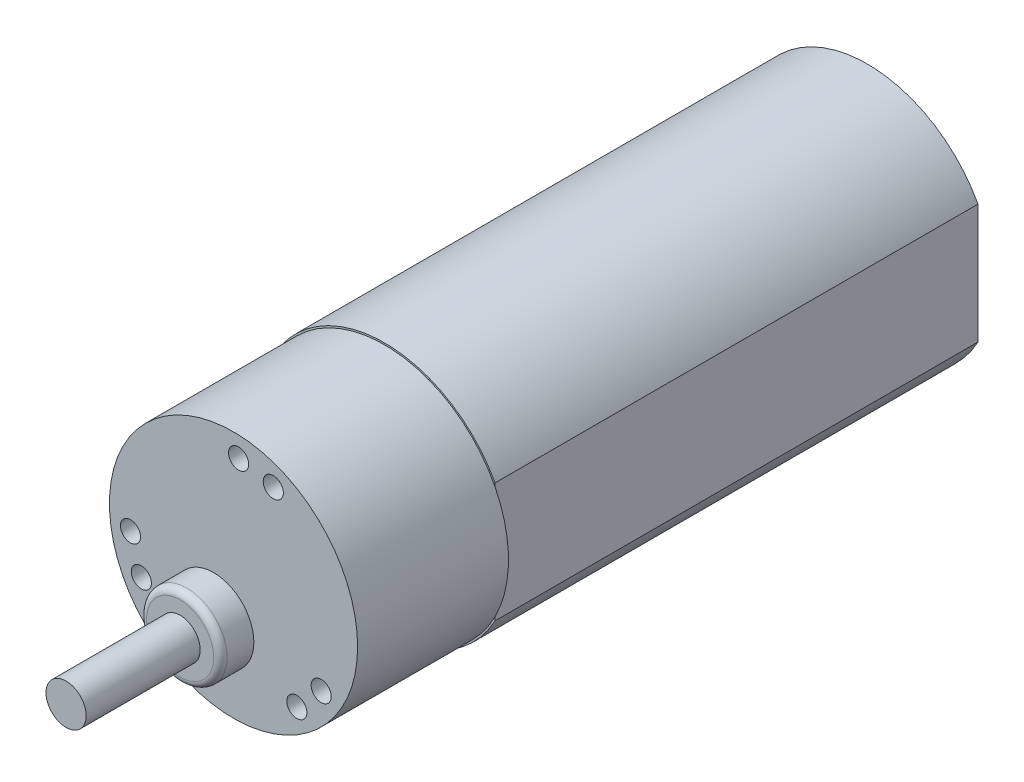
ISO-10303-21;
HEADER;
FILE_DESCRIPTION(('STEP AP214'),'2;1');
FILE_NAME('part.step','',(''),(''),'','','');
FILE_SCHEMA(('AUTOMOTIVE_DESIGN { 1 0 10303 214 1 1 1 1 }'));
ENDSEC;
DATA;
#1=APPLICATION_CONTEXT('core data for automotive mechanical design processes');
#2=APPLICATION_PROTOCOL_DEFINITION('international standard','automotive_design',2000,#1);
#3=PRODUCT_CONTEXT('',#1,'mechanical');
#4=PRODUCT('Part','Part','',(#3));
#5=PRODUCT_RELATED_PRODUCT_CATEGORY('part','',(#4));
#6=PRODUCT_DEFINITION_FORMATION('','',#4);
#7=PRODUCT_DEFINITION_CONTEXT('part definition',#1,'design');
#8=PRODUCT_DEFINITION('design','',#6,#7);
#9=PRODUCT_DEFINITION_SHAPE('','',#8);
#10=(LENGTH_UNIT() NAMED_UNIT(*) SI_UNIT(.MILLI.,.METRE.));
#11=(NAMED_UNIT(*) PLANE_ANGLE_UNIT() SI_UNIT($,.RADIAN.));
#12=(NAMED_UNIT(*) SI_UNIT($,.STERADIAN.) SOLID_ANGLE_UNIT());
#13=UNCERTAINTY_MEASURE_WITH_UNIT(LENGTH_MEASURE(1.E-05),#10,'distance_accuracy_value','');
#14=(GEOMETRIC_REPRESENTATION_CONTEXT(3) GLOBAL_UNCERTAINTY_ASSIGNED_CONTEXT((#13)) GLOBAL_UNIT_ASSIGNED_CONTEXT((#10,
#11,#12)) REPRESENTATION_CONTEXT('',''));
#15=CARTESIAN_POINT('',(0.,0.,0.));
#16=DIRECTION('',(0.,0.,1.));
#17=DIRECTION('',(1.,0.,0.));
#18=AXIS2_PLACEMENT_3D('',#15,#16,#17);
#19=CARTESIAN_POINT('',(-2.96393009011187,-7.16083922602165,99.5));
#20=DIRECTION('',(0.,0.,1.));
#21=DIRECTION('',(1.,0.,0.));
#22=AXIS2_PLACEMENT_3D('',#19,#20,#21);
#23=PLANE('',#22);
#24=CARTESIAN_POINT('',(-2.96393009011187,-7.16083922602165,99.5));
#25=DIRECTION('',(0.,0.,1.));
#26=DIRECTION('',(1.,0.,0.));
#27=AXIS2_PLACEMENT_3D('',#24,#25,#26);
#28=CIRCLE('',#27,5.);
#29=CARTESIAN_POINT('',(2.03606990988813,-7.16083922602165,99.5));
#30=VERTEX_POINT('',#29);
#31=EDGE_CURVE('E38',#30,#30,#28,.T.);
#32=ORIENTED_EDGE('',*,*,#31,.T.);
#33=EDGE_LOOP('',(#32));
#34=FACE_BOUND('',#33,.T.);
#35=CARTESIAN_POINT('',(-2.96393009011187,-7.16083922602165,99.5));
#36=DIRECTION('',(0.,0.,1.));
#37=DIRECTION('',(1.,0.,0.));
#38=AXIS2_PLACEMENT_3D('',#35,#36,#37);
#39=CIRCLE('',#38,3.);
#40=CARTESIAN_POINT('',(0.0360699098881354,-7.16083922602165,99.5));
#41=VERTEX_POINT('',#40);
#42=EDGE_CURVE('E134',#41,#41,#39,.T.);
#43=ORIENTED_EDGE('',*,*,#42,.F.);
#44=EDGE_LOOP('',(#43));
#45=FACE_BOUND('',#44,.T.);
#46=ADVANCED_FACE('F30',(#34,#45),#23,.T.);
#47=CARTESIAN_POINT('',(-2.96393009011187,-7.16083922602165,98.5));
#48=DIRECTION('',(0.,0.,1.));
#49=DIRECTION('',(1.,0.,0.));
#50=AXIS2_PLACEMENT_3D('',#47,#48,#49);
#51=TOROIDAL_SURFACE('',#50,5.,1.);
#52=ORIENTED_EDGE('',*,*,#31,.F.);
#53=EDGE_LOOP('',(#52));
#54=FACE_BOUND('',#53,.T.);
#55=CARTESIAN_POINT('',(-2.96393009011187,-7.16083922602165,98.5));
#56=DIRECTION('',(0.,0.,1.));
#57=DIRECTION('',(1.,0.,0.));
#58=AXIS2_PLACEMENT_3D('',#55,#56,#57);
#59=CIRCLE('',#58,6.);
#60=CARTESIAN_POINT('',(3.03606990988813,-7.16083922602165,98.5));
#61=VERTEX_POINT('',#60);
#62=EDGE_CURVE('E11',#61,#61,#59,.F.);
#63=ORIENTED_EDGE('',*,*,#62,.F.);
#64=EDGE_LOOP('',(#63));
#65=FACE_BOUND('',#64,.T.);
#66=ADVANCED_FACE('F32',(#54,#65),#51,.T.);
#67=CARTESIAN_POINT('',(0.,0.,72.));
#68=DIRECTION('',(0.,0.,1.));
#69=DIRECTION('',(1.,0.,0.));
#70=AXIS2_PLACEMENT_3D('',#67,#68,#69);
#71=PLANE('',#70);
#72=CARTESIAN_POINT('',(0.,0.,72.));
#73=DIRECTION('',(0.,0.,1.));
#74=DIRECTION('',(1.,0.,0.));
#75=AXIS2_PLACEMENT_3D('',#72,#73,#74);
#76=CIRCLE('',#75,18.5);
#77=CARTESIAN_POINT('',(16.5,8.36660026534074,72.));
#78=VERTEX_POINT('',#77);
#79=CARTESIAN_POINT('',(-16.5,8.36660026534074,72.));
#80=VERTEX_POINT('',#79);
#81=EDGE_CURVE('E53',#78,#80,#76,.T.);
#82=ORIENTED_EDGE('',*,*,#81,.F.);
#83=DIRECTION('',(0.,1.,0.));
#84=VECTOR('',#83,1.);
#85=CARTESIAN_POINT('',(16.5,8.90575656527845,72.));
#86=LINE('',#85,#84);
#87=CARTESIAN_POINT('',(16.5,8.90575656527845,72.));
#88=VERTEX_POINT('',#87);
#89=EDGE_CURVE('E194',#78,#88,#86,.T.);
#90=ORIENTED_EDGE('',*,*,#89,.T.);
#91=CARTESIAN_POINT('',(0.,0.,72.));
#92=DIRECTION('',(0.,0.,1.));
#93=DIRECTION('',(1.,0.,0.));
#94=AXIS2_PLACEMENT_3D('',#91,#92,#93);
#95=CIRCLE('',#94,18.75);
#96=CARTESIAN_POINT('',(-16.5,8.90575656527845,72.));
#97=VERTEX_POINT('',#96);
#98=EDGE_CURVE('E184',#88,#97,#95,.T.);
#99=ORIENTED_EDGE('',*,*,#98,.T.);
#100=DIRECTION('',(0.,-1.,0.));
#101=VECTOR('',#100,1.);
#102=CARTESIAN_POINT('',(-16.5,8.90575656527845,72.));
#103=LINE('',#102,#101);
#104=EDGE_CURVE('E189',#97,#80,#103,.T.);
#105=ORIENTED_EDGE('',*,*,#104,.T.);
#106=EDGE_LOOP('',(#82,#90,#99,#105));
#107=FACE_BOUND('',#106,.T.);
#108=ADVANCED_FACE('F230',(#107),#71,.T.);
#109=CARTESIAN_POINT('',(0.,0.,72.));
#110=DIRECTION('',(0.,0.,-1.));
#111=DIRECTION('',(-1.,0.,0.));
#112=AXIS2_PLACEMENT_3D('',#109,#110,#111);
#113=CYLINDRICAL_SURFACE('',#112,18.75);
#114=CARTESIAN_POINT('',(0.,0.,0.));
#115=DIRECTION('',(0.,0.,1.));
#116=DIRECTION('',(1.,0.,0.));
#117=AXIS2_PLACEMENT_3D('',#114,#115,#116);
#118=CIRCLE('',#117,18.75);
#119=CARTESIAN_POINT('',(16.5,8.90575656527845,0.));
#120=VERTEX_POINT('',#119);
#121=CARTESIAN_POINT('',(-16.5,8.90575656527845,0.));
#122=VERTEX_POINT('',#121);
#123=EDGE_CURVE('E180',#120,#122,#118,.T.);
#124=ORIENTED_EDGE('',*,*,#123,.T.);
#125=DIRECTION('',(0.,0.,-1.));
#126=VECTOR('',#125,1.);
#127=CARTESIAN_POINT('',(-16.5,8.90575656527845,0.));
#128=LINE('',#127,#126);
#129=CARTESIAN_POINT('',(-16.5,8.90575656527845,14.5455442334708));
#130=VERTEX_POINT('',#129);
#131=EDGE_CURVE('E118',#130,#122,#128,.T.);
#132=ORIENTED_EDGE('',*,*,#131,.F.);
#133=DIRECTION('',(0.,0.,-1.));
#134=VECTOR('',#133,1.);
#135=CARTESIAN_POINT('',(-16.5,8.90575656527845,72.));
#136=LINE('',#135,#134);
#137=EDGE_CURVE('E211',#97,#130,#136,.T.);
#138=ORIENTED_EDGE('',*,*,#137,.F.);
#139=ORIENTED_EDGE('',*,*,#98,.F.);
#140=DIRECTION('',(0.,0.,-1.));
#141=VECTOR('',#140,1.);
#142=CARTESIAN_POINT('',(16.5,8.90575656527845,72.));
#143=LINE('',#142,#141);
#144=EDGE_CURVE('E197',#88,#120,#143,.T.);
#145=ORIENTED_EDGE('',*,*,#144,.T.);
#146=EDGE_LOOP('',(#124,#132,#138,#139,#145));
#147=FACE_BOUND('',#146,.T.);
#148=ADVANCED_FACE('F236',(#147),#113,.T.);
#149=CARTESIAN_POINT('',(-16.5,8.90575656527845,72.));
#150=DIRECTION('',(1.,0.,0.));
#151=DIRECTION('',(0.,0.,-1.));
#152=AXIS2_PLACEMENT_3D('',#149,#150,#151);
#153=PLANE('',#152);
#154=ORIENTED_EDGE('',*,*,#137,.T.);
#155=DIRECTION('',(0.,1.,0.));
#156=VECTOR('',#155,1.);
#157=CARTESIAN_POINT('',(-16.5,8.90575656527845,14.5455442334708));
#158=LINE('',#157,#156);
#159=CARTESIAN_POINT('',(-16.5,-8.90575656527845,14.5455442334708));
#160=VERTEX_POINT('',#159);
#161=EDGE_CURVE('E243',#160,#130,#158,.T.);
#162=ORIENTED_EDGE('',*,*,#161,.F.);
#163=DIRECTION('',(0.,0.,-1.));
#164=VECTOR('',#163,1.);
#165=CARTESIAN_POINT('',(-16.5,-8.90575656527845,72.));
#166=LINE('',#165,#164);
#167=CARTESIAN_POINT('',(-16.5,-8.90575656527845,72.));
#168=VERTEX_POINT('',#167);
#169=EDGE_CURVE('E208',#168,#160,#166,.T.);
#170=ORIENTED_EDGE('',*,*,#169,.F.);
#171=CARTESIAN_POINT('',(-16.5,-8.36660026534074,72.));
#172=VERTEX_POINT('',#171);
#173=EDGE_CURVE('E187',#172,#168,#103,.T.);
#174=ORIENTED_EDGE('',*,*,#173,.F.);
#175=EDGE_CURVE('E192',#80,#172,#103,.T.);
#176=ORIENTED_EDGE('',*,*,#175,.F.);
#177=ORIENTED_EDGE('',*,*,#104,.F.);
#178=EDGE_LOOP('',(#154,#162,#170,#174,#176,#177));
#179=FACE_BOUND('',#178,.T.);
#180=ADVANCED_FACE('F240',(#179),#153,.F.);
#181=CARTESIAN_POINT('',(0.,0.,72.));
#182=DIRECTION('',(0.,0.,-1.));
#183=DIRECTION('',(-1.,0.,0.));
#184=AXIS2_PLACEMENT_3D('',#181,#182,#183);
#185=CYLINDRICAL_SURFACE('',#184,18.75);
#186=CARTESIAN_POINT('',(0.,0.,0.));
#187=DIRECTION('',(0.,0.,1.));
#188=DIRECTION('',(1.,0.,0.));
#189=AXIS2_PLACEMENT_3D('',#186,#187,#188);
#190=CIRCLE('',#189,18.75);
#191=CARTESIAN_POINT('',(-16.5,-8.90575656527845,0.));
#192=VERTEX_POINT('',#191);
#193=CARTESIAN_POINT('',(16.5,-8.90575656527845,0.));
#194=VERTEX_POINT('',#193);
#195=EDGE_CURVE('E123',#192,#194,#190,.T.);
#196=ORIENTED_EDGE('',*,*,#195,.T.);
#197=DIRECTION('',(0.,0.,-1.));
#198=VECTOR('',#197,1.);
#199=CARTESIAN_POINT('',(16.5,-8.90575656527845,72.));
#200=LINE('',#199,#198);
#201=CARTESIAN_POINT('',(16.5,-8.90575656527845,72.));
#202=VERTEX_POINT('',#201);
#203=EDGE_CURVE('E205',#202,#194,#200,.T.);
#204=ORIENTED_EDGE('',*,*,#203,.F.);
#205=CARTESIAN_POINT('',(0.,0.,72.));
#206=DIRECTION('',(0.,0.,1.));
#207=DIRECTION('',(1.,0.,0.));
#208=AXIS2_PLACEMENT_3D('',#205,#206,#207);
#209=CIRCLE('',#208,18.75);
#210=EDGE_CURVE('E191',#168,#202,#209,.T.);
#211=ORIENTED_EDGE('',*,*,#210,.F.);
#212=ORIENTED_EDGE('',*,*,#169,.T.);
#213=DIRECTION('',(0.,0.,1.));
#214=VECTOR('',#213,1.);
#215=CARTESIAN_POINT('',(-16.5,-8.90575656527845,0.));
#216=LINE('',#215,#214);
#217=EDGE_CURVE('E259',#192,#160,#216,.T.);
#218=ORIENTED_EDGE('',*,*,#217,.F.);
#219=EDGE_LOOP('',(#196,#204,#211,#212,#218));
#220=FACE_BOUND('',#219,.T.);
#221=ADVANCED_FACE('F253',(#220),#185,.T.);
#222=CARTESIAN_POINT('',(16.5,8.90575656527845,72.));
#223=DIRECTION('',(-1.,0.,0.));
#224=DIRECTION('',(0.,0.,1.));
#225=AXIS2_PLACEMENT_3D('',#222,#223,#224);
#226=PLANE('',#225);
#227=DIRECTION('',(0.,1.,0.));
#228=VECTOR('',#227,1.);
#229=CARTESIAN_POINT('',(16.5,8.90575656527845,0.));
#230=LINE('',#229,#228);
#231=EDGE_CURVE('E188',#194,#120,#230,.T.);
#232=ORIENTED_EDGE('',*,*,#231,.T.);
#233=ORIENTED_EDGE('',*,*,#144,.F.);
#234=ORIENTED_EDGE('',*,*,#89,.F.);
#235=CARTESIAN_POINT('',(16.5,-8.36660026534074,72.));
#236=VERTEX_POINT('',#235);
#237=EDGE_CURVE('E198',#236,#78,#86,.T.);
#238=ORIENTED_EDGE('',*,*,#237,.F.);
#239=EDGE_CURVE('E195',#202,#236,#86,.T.);
#240=ORIENTED_EDGE('',*,*,#239,.F.);
#241=ORIENTED_EDGE('',*,*,#203,.T.);
#242=EDGE_LOOP('',(#232,#233,#234,#238,#240,#241));
#243=FACE_BOUND('',#242,.T.);
#244=ADVANCED_FACE('F233',(#243),#226,.F.);
#245=EDGE_CURVE('E183',#172,#236,#76,.T.);
#246=ORIENTED_EDGE('',*,*,#245,.F.);
#247=ORIENTED_EDGE('',*,*,#173,.T.);
#248=ORIENTED_EDGE('',*,*,#210,.T.);
#249=ORIENTED_EDGE('',*,*,#239,.T.);
#250=EDGE_LOOP('',(#246,#247,#248,#249));
#251=FACE_BOUND('',#250,.T.);
#252=ADVANCED_FACE('F249',(#251),#71,.T.);
#253=CARTESIAN_POINT('',(0.,0.,0.));
#254=DIRECTION('',(0.,0.,1.));
#255=DIRECTION('',(1.,0.,0.));
#256=AXIS2_PLACEMENT_3D('',#253,#254,#255);
#257=PLANE('',#256);
#258=DIRECTION('',(0.,-1.,0.));
#259=VECTOR('',#258,1.);
#260=CARTESIAN_POINT('',(-9.5,8.90575656527845,0.));
#261=LINE('',#260,#259);
#262=CARTESIAN_POINT('',(-9.5,8.90575656527845,0.));
#263=VERTEX_POINT('',#262);
#264=CARTESIAN_POINT('',(-9.5,-8.90575656527845,0.));
#265=VERTEX_POINT('',#264);
#266=EDGE_CURVE('E112',#263,#265,#261,.T.);
#267=ORIENTED_EDGE('',*,*,#266,.F.);
#268=DIRECTION('',(-1.,0.,0.));
#269=VECTOR('',#268,1.);
#270=CARTESIAN_POINT('',(-9.5,8.90575656527845,0.));
#271=LINE('',#270,#269);
#272=EDGE_CURVE('E137',#263,#122,#271,.T.);
#273=ORIENTED_EDGE('',*,*,#272,.T.);
#274=ORIENTED_EDGE('',*,*,#123,.F.);
#275=ORIENTED_EDGE('',*,*,#231,.F.);
#276=ORIENTED_EDGE('',*,*,#195,.F.);
#277=DIRECTION('',(-1.,0.,0.));
#278=VECTOR('',#277,1.);
#279=CARTESIAN_POINT('',(-9.5,-8.90575656527845,0.));
#280=LINE('',#279,#278);
#281=EDGE_CURVE('E107',#265,#192,#280,.T.);
#282=ORIENTED_EDGE('',*,*,#281,.F.);
#283=EDGE_LOOP('',(#267,#273,#274,#275,#276,#282));
#284=FACE_BOUND('',#283,.T.);
#285=ADVANCED_FACE('F121',(#284),#257,.F.);
#286=CARTESIAN_POINT('',(0.,0.,72.));
#287=DIRECTION('',(0.,0.,1.));
#288=DIRECTION('',(1.,0.,0.));
#289=AXIS2_PLACEMENT_3D('',#286,#287,#288);
#290=PLANE('',#289);
#291=EDGE_CURVE('E182',#80,#172,#76,.T.);
#292=ORIENTED_EDGE('',*,*,#291,.F.);
#293=ORIENTED_EDGE('',*,*,#175,.T.);
#294=EDGE_LOOP('',(#292,#293));
#295=FACE_BOUND('',#294,.T.);
#296=ADVANCED_FACE('F247',(#295),#290,.F.);
#297=EDGE_CURVE('E174',#236,#78,#76,.T.);
#298=ORIENTED_EDGE('',*,*,#297,.F.);
#299=ORIENTED_EDGE('',*,*,#237,.T.);
#300=EDGE_LOOP('',(#298,#299));
#301=FACE_BOUND('',#300,.T.);
#302=ADVANCED_FACE('F225',(#301),#290,.F.);
#303=CARTESIAN_POINT('',(0.,0.,94.5));
#304=DIRECTION('',(0.,0.,-1.));
#305=DIRECTION('',(-1.,0.,0.));
#306=AXIS2_PLACEMENT_3D('',#303,#304,#305);
#307=CYLINDRICAL_SURFACE('',#306,18.5);
#308=CARTESIAN_POINT('',(0.,0.,94.5));
#309=DIRECTION('',(0.,0.,1.));
#310=DIRECTION('',(1.,0.,0.));
#311=AXIS2_PLACEMENT_3D('',#308,#309,#310);
#312=CIRCLE('',#311,18.5);
#313=CARTESIAN_POINT('',(18.5,0.,94.5));
#314=VERTEX_POINT('',#313);
#315=EDGE_CURVE('E177',#314,#314,#312,.T.);
#316=ORIENTED_EDGE('',*,*,#315,.F.);
#317=EDGE_LOOP('',(#316));
#318=FACE_BOUND('',#317,.T.);
#319=ORIENTED_EDGE('',*,*,#81,.T.);
#320=ORIENTED_EDGE('',*,*,#291,.T.);
#321=ORIENTED_EDGE('',*,*,#245,.T.);
#322=ORIENTED_EDGE('',*,*,#297,.T.);
#323=EDGE_LOOP('',(#319,#320,#321,#322));
#324=FACE_BOUND('',#323,.T.);
#325=ADVANCED_FACE('F222',(#318,#324),#307,.T.);
#326=CARTESIAN_POINT('',(0.,0.,94.5));
#327=DIRECTION('',(0.,0.,1.));
#328=DIRECTION('',(1.,0.,0.));
#329=AXIS2_PLACEMENT_3D('',#326,#327,#328);
#330=PLANE('',#329);
#331=CARTESIAN_POINT('',(9.4390072741897,-12.2945167321776,94.5));
#332=DIRECTION('',(0.,0.,1.));
#333=DIRECTION('',(1.,0.,0.));
#334=AXIS2_PLACEMENT_3D('',#331,#332,#333);
#335=CIRCLE('',#334,1.5);
#336=CARTESIAN_POINT('',(10.9390072741897,-12.2945167321776,94.5));
#337=VERTEX_POINT('',#336);
#338=EDGE_CURVE('E133',#337,#337,#335,.T.);
#339=ORIENTED_EDGE('',*,*,#338,.F.);
#340=EDGE_LOOP('',(#339));
#341=FACE_BOUND('',#340,.T.);
#342=CARTESIAN_POINT('',(5.92786018022369,14.3216784520432,94.5));
#343=DIRECTION('',(0.,0.,1.));
#344=DIRECTION('',(1.,0.,0.));
#345=AXIS2_PLACEMENT_3D('',#342,#343,#344);
#346=CIRCLE('',#345,1.5);
#347=CARTESIAN_POINT('',(7.42786018022369,14.3216784520432,94.5));
#348=VERTEX_POINT('',#347);
#349=EDGE_CURVE('E141',#348,#348,#346,.T.);
#350=ORIENTED_EDGE('',*,*,#349,.F.);
#351=EDGE_LOOP('',(#350));
#352=FACE_BOUND('',#351,.T.);
#353=CARTESIAN_POINT('',(-2.96393009011187,-7.16083922602165,94.5));
#354=DIRECTION('',(0.,0.,1.));
#355=DIRECTION('',(1.,0.,0.));
#356=AXIS2_PLACEMENT_3D('',#353,#354,#355);
#357=CIRCLE('',#356,6.);
#358=CARTESIAN_POINT('',(3.03606990988813,-7.16083922602165,94.5));
#359=VERTEX_POINT('',#358);
#360=EDGE_CURVE('E147',#359,#359,#357,.T.);
#361=ORIENTED_EDGE('',*,*,#360,.F.);
#362=EDGE_LOOP('',(#361));
#363=FACE_BOUND('',#362,.T.);
#364=CARTESIAN_POINT('',(-15.3668674544134,-2.02716171986576,94.5));
#365=DIRECTION('',(0.,0.,1.));
#366=DIRECTION('',(1.,0.,0.));
#367=AXIS2_PLACEMENT_3D('',#364,#365,#366);
#368=CIRCLE('',#367,1.5);
#369=CARTESIAN_POINT('',(-13.8668674544134,-2.02716171986576,94.5));
#370=VERTEX_POINT('',#369);
#371=EDGE_CURVE('E152',#370,#370,#368,.T.);
#372=ORIENTED_EDGE('',*,*,#371,.F.);
#373=EDGE_LOOP('',(#372));
#374=FACE_BOUND('',#373,.T.);
#375=CARTESIAN_POINT('',(13.0701283051295,-8.4264909047432,94.5));
#376=DIRECTION('',(0.,0.,1.));
#377=DIRECTION('',(1.,0.,0.));
#378=AXIS2_PLACEMENT_3D('',#375,#376,#377);
#379=CIRCLE('',#378,1.5);
#380=CARTESIAN_POINT('',(14.5701283051295,-8.4264909047432,94.5));
#381=VERTEX_POINT('',#380);
#382=EDGE_CURVE('E156',#381,#381,#379,.T.);
#383=ORIENTED_EDGE('',*,*,#382,.F.);
#384=EDGE_LOOP('',(#383));
#385=FACE_BOUND('',#384,.T.);
#386=CARTESIAN_POINT('',(0.757881482870959,15.4305537191784,94.5));
#387=DIRECTION('',(0.,0.,1.));
#388=DIRECTION('',(1.,0.,0.));
#389=AXIS2_PLACEMENT_3D('',#386,#387,#388);
#390=CIRCLE('',#389,1.5);
#391=CARTESIAN_POINT('',(2.25788148287096,15.4305537191784,94.5));
#392=VERTEX_POINT('',#391);
#393=EDGE_CURVE('E162',#392,#392,#390,.T.);
#394=ORIENTED_EDGE('',*,*,#393,.F.);
#395=EDGE_LOOP('',(#394));
#396=FACE_BOUND('',#395,.T.);
#397=CARTESIAN_POINT('',(-13.7468018095347,-7.16068711852262,94.5));
#398=DIRECTION('',(0.,0.,1.));
#399=DIRECTION('',(1.,0.,0.));
#400=AXIS2_PLACEMENT_3D('',#397,#398,#399);
#401=CIRCLE('',#400,1.5);
#402=CARTESIAN_POINT('',(-12.2468018095347,-7.16068711852262,94.5));
#403=VERTEX_POINT('',#402);
#404=EDGE_CURVE('E168',#403,#403,#401,.T.);
#405=ORIENTED_EDGE('',*,*,#404,.F.);
#406=EDGE_LOOP('',(#405));
#407=FACE_BOUND('',#406,.T.);
#408=ORIENTED_EDGE('',*,*,#315,.T.);
#409=EDGE_LOOP('',(#408));
#410=FACE_BOUND('',#409,.T.);
#411=ADVANCED_FACE('F335',(#341,#352,#363,#374,#385,#396,#407,#410),#330,.T.);
#412=CARTESIAN_POINT('',(-13.7468018095347,-7.16068711852262,89.5));
#413=DIRECTION('',(0.,0.,1.));
#414=DIRECTION('',(1.,0.,0.));
#415=AXIS2_PLACEMENT_3D('',#412,#413,#414);
#416=CYLINDRICAL_SURFACE('',#415,1.5);
#417=CARTESIAN_POINT('',(-13.7468018095347,-7.16068711852262,89.5));
#418=DIRECTION('',(0.,0.,1.));
#419=DIRECTION('',(1.,0.,0.));
#420=AXIS2_PLACEMENT_3D('',#417,#418,#419);
#421=CIRCLE('',#420,1.5);
#422=CARTESIAN_POINT('',(-12.2468018095347,-7.16068711852262,89.5));
#423=VERTEX_POINT('',#422);
#424=EDGE_CURVE('E171',#423,#423,#421,.T.);
#425=ORIENTED_EDGE('',*,*,#424,.F.);
#426=EDGE_LOOP('',(#425));
#427=FACE_BOUND('',#426,.T.);
#428=ORIENTED_EDGE('',*,*,#404,.T.);
#429=EDGE_LOOP('',(#428));
#430=FACE_BOUND('',#429,.T.);
#431=ADVANCED_FACE('F331',(#427,#430),#416,.F.);
#432=CARTESIAN_POINT('',(-13.7468018095347,-7.16068711852262,89.5));
#433=DIRECTION('',(0.,0.,1.));
#434=DIRECTION('',(1.,0.,0.));
#435=AXIS2_PLACEMENT_3D('',#432,#433,#434);
#436=PLANE('',#435);
#437=ORIENTED_EDGE('',*,*,#424,.T.);
#438=EDGE_LOOP('',(#437));
#439=FACE_BOUND('',#438,.T.);
#440=ADVANCED_FACE('F327',(#439),#436,.T.);
#441=CARTESIAN_POINT('',(0.757881482870959,15.4305537191784,89.5));
#442=DIRECTION('',(0.,0.,1.));
#443=DIRECTION('',(1.,0.,0.));
#444=AXIS2_PLACEMENT_3D('',#441,#442,#443);
#445=CYLINDRICAL_SURFACE('',#444,1.5);
#446=CARTESIAN_POINT('',(0.757881482870959,15.4305537191784,89.5));
#447=DIRECTION('',(0.,0.,1.));
#448=DIRECTION('',(1.,0.,0.));
#449=AXIS2_PLACEMENT_3D('',#446,#447,#448);
#450=CIRCLE('',#449,1.5);
#451=CARTESIAN_POINT('',(2.25788148287096,15.4305537191784,89.5));
#452=VERTEX_POINT('',#451);
#453=EDGE_CURVE('E165',#452,#452,#450,.T.);
#454=ORIENTED_EDGE('',*,*,#453,.F.);
#455=EDGE_LOOP('',(#454));
#456=FACE_BOUND('',#455,.T.);
#457=ORIENTED_EDGE('',*,*,#393,.T.);
#458=EDGE_LOOP('',(#457));
#459=FACE_BOUND('',#458,.T.);
#460=ADVANCED_FACE('F323',(#456,#459),#445,.F.);
#461=CARTESIAN_POINT('',(0.757881482870959,15.4305537191784,89.5));
#462=DIRECTION('',(0.,0.,1.));
#463=DIRECTION('',(1.,0.,0.));
#464=AXIS2_PLACEMENT_3D('',#461,#462,#463);
#465=PLANE('',#464);
#466=ORIENTED_EDGE('',*,*,#453,.T.);
#467=EDGE_LOOP('',(#466));
#468=FACE_BOUND('',#467,.T.);
#469=ADVANCED_FACE('F319',(#468),#465,.T.);
#470=CARTESIAN_POINT('',(13.0701283051295,-8.4264909047432,89.5));
#471=DIRECTION('',(0.,0.,1.));
#472=DIRECTION('',(1.,0.,0.));
#473=AXIS2_PLACEMENT_3D('',#470,#471,#472);
#474=CYLINDRICAL_SURFACE('',#473,1.5);
#475=CARTESIAN_POINT('',(13.0701283051295,-8.4264909047432,89.5));
#476=DIRECTION('',(0.,0.,1.));
#477=DIRECTION('',(1.,0.,0.));
#478=AXIS2_PLACEMENT_3D('',#475,#476,#477);
#479=CIRCLE('',#478,1.5);
#480=CARTESIAN_POINT('',(14.5701283051295,-8.4264909047432,89.5));
#481=VERTEX_POINT('',#480);
#482=EDGE_CURVE('E159',#481,#481,#479,.T.);
#483=ORIENTED_EDGE('',*,*,#482,.F.);
#484=EDGE_LOOP('',(#483));
#485=FACE_BOUND('',#484,.T.);
#486=ORIENTED_EDGE('',*,*,#382,.T.);
#487=EDGE_LOOP('',(#486));
#488=FACE_BOUND('',#487,.T.);
#489=ADVANCED_FACE('F315',(#485,#488),#474,.F.);
#490=CARTESIAN_POINT('',(13.0701283051295,-8.4264909047432,89.5));
#491=DIRECTION('',(0.,0.,1.));
#492=DIRECTION('',(1.,0.,0.));
#493=AXIS2_PLACEMENT_3D('',#490,#491,#492);
#494=PLANE('',#493);
#495=ORIENTED_EDGE('',*,*,#482,.T.);
#496=EDGE_LOOP('',(#495));
#497=FACE_BOUND('',#496,.T.);
#498=ADVANCED_FACE('F311',(#497),#494,.T.);
#499=CARTESIAN_POINT('',(-15.3668674544134,-2.02716171986576,89.5));
#500=DIRECTION('',(0.,0.,1.));
#501=DIRECTION('',(1.,0.,0.));
#502=AXIS2_PLACEMENT_3D('',#499,#500,#501);
#503=CYLINDRICAL_SURFACE('',#502,1.5);
#504=CARTESIAN_POINT('',(-15.3668674544134,-2.02716171986576,89.5));
#505=DIRECTION('',(0.,0.,1.));
#506=DIRECTION('',(1.,0.,0.));
#507=AXIS2_PLACEMENT_3D('',#504,#505,#506);
#508=CIRCLE('',#507,1.5);
#509=CARTESIAN_POINT('',(-13.8668674544134,-2.02716171986576,89.5));
#510=VERTEX_POINT('',#509);
#511=EDGE_CURVE('E153',#510,#510,#508,.T.);
#512=ORIENTED_EDGE('',*,*,#511,.F.);
#513=EDGE_LOOP('',(#512));
#514=FACE_BOUND('',#513,.T.);
#515=ORIENTED_EDGE('',*,*,#371,.T.);
#516=EDGE_LOOP('',(#515));
#517=FACE_BOUND('',#516,.T.);
#518=ADVANCED_FACE('F307',(#514,#517),#503,.F.);
#519=CARTESIAN_POINT('',(-15.3668674544134,-2.02716171986576,89.5));
#520=DIRECTION('',(0.,0.,1.));
#521=DIRECTION('',(1.,0.,0.));
#522=AXIS2_PLACEMENT_3D('',#519,#520,#521);
#523=PLANE('',#522);
#524=ORIENTED_EDGE('',*,*,#511,.T.);
#525=EDGE_LOOP('',(#524));
#526=FACE_BOUND('',#525,.T.);
#527=ADVANCED_FACE('F303',(#526),#523,.T.);
#528=CARTESIAN_POINT('',(5.92786018022369,14.3216784520432,89.5));
#529=DIRECTION('',(0.,0.,1.));
#530=DIRECTION('',(1.,0.,0.));
#531=AXIS2_PLACEMENT_3D('',#528,#529,#530);
#532=CYLINDRICAL_SURFACE('',#531,1.5);
#533=CARTESIAN_POINT('',(5.92786018022369,14.3216784520432,89.5));
#534=DIRECTION('',(0.,0.,1.));
#535=DIRECTION('',(1.,0.,0.));
#536=AXIS2_PLACEMENT_3D('',#533,#534,#535);
#537=CIRCLE('',#536,1.5);
#538=CARTESIAN_POINT('',(7.42786018022369,14.3216784520432,89.5));
#539=VERTEX_POINT('',#538);
#540=EDGE_CURVE('E144',#539,#539,#537,.T.);
#541=ORIENTED_EDGE('',*,*,#540,.F.);
#542=EDGE_LOOP('',(#541));
#543=FACE_BOUND('',#542,.T.);
#544=ORIENTED_EDGE('',*,*,#349,.T.);
#545=EDGE_LOOP('',(#544));
#546=FACE_BOUND('',#545,.T.);
#547=ADVANCED_FACE('F299',(#543,#546),#532,.F.);
#548=CARTESIAN_POINT('',(5.92786018022369,14.3216784520432,89.5));
#549=DIRECTION('',(0.,0.,1.));
#550=DIRECTION('',(1.,0.,0.));
#551=AXIS2_PLACEMENT_3D('',#548,#549,#550);
#552=PLANE('',#551);
#553=ORIENTED_EDGE('',*,*,#540,.T.);
#554=EDGE_LOOP('',(#553));
#555=FACE_BOUND('',#554,.T.);
#556=ADVANCED_FACE('F295',(#555),#552,.T.);
#557=CARTESIAN_POINT('',(9.4390072741897,-12.2945167321776,89.5));
#558=DIRECTION('',(0.,0.,1.));
#559=DIRECTION('',(1.,0.,0.));
#560=AXIS2_PLACEMENT_3D('',#557,#558,#559);
#561=CYLINDRICAL_SURFACE('',#560,1.5);
#562=CARTESIAN_POINT('',(9.4390072741897,-12.2945167321776,89.5));
#563=DIRECTION('',(0.,0.,1.));
#564=DIRECTION('',(1.,0.,0.));
#565=AXIS2_PLACEMENT_3D('',#562,#563,#564);
#566=CIRCLE('',#565,1.5);
#567=CARTESIAN_POINT('',(10.9390072741897,-12.2945167321776,89.5));
#568=VERTEX_POINT('',#567);
#569=EDGE_CURVE('E138',#568,#568,#566,.T.);
#570=ORIENTED_EDGE('',*,*,#569,.F.);
#571=EDGE_LOOP('',(#570));
#572=FACE_BOUND('',#571,.T.);
#573=ORIENTED_EDGE('',*,*,#338,.T.);
#574=EDGE_LOOP('',(#573));
#575=FACE_BOUND('',#574,.T.);
#576=ADVANCED_FACE('F291',(#572,#575),#561,.F.);
#577=CARTESIAN_POINT('',(9.4390072741897,-12.2945167321776,89.5));
#578=DIRECTION('',(0.,0.,1.));
#579=DIRECTION('',(1.,0.,0.));
#580=AXIS2_PLACEMENT_3D('',#577,#578,#579);
#581=PLANE('',#580);
#582=ORIENTED_EDGE('',*,*,#569,.T.);
#583=EDGE_LOOP('',(#582));
#584=FACE_BOUND('',#583,.T.);
#585=ADVANCED_FACE('F287',(#584),#581,.T.);
#586=CARTESIAN_POINT('',(-2.96393009011187,-7.16083922602165,99.5));
#587=DIRECTION('',(0.,0.,-1.));
#588=DIRECTION('',(-1.,0.,0.));
#589=AXIS2_PLACEMENT_3D('',#586,#587,#588);
#590=CYLINDRICAL_SURFACE('',#589,6.);
#591=ORIENTED_EDGE('',*,*,#62,.T.);
#592=EDGE_LOOP('',(#591));
#593=FACE_BOUND('',#592,.T.);
#594=ORIENTED_EDGE('',*,*,#360,.T.);
#595=EDGE_LOOP('',(#594));
#596=FACE_BOUND('',#595,.T.);
#597=ADVANCED_FACE('F284',(#593,#596),#590,.T.);
#598=CARTESIAN_POINT('',(-2.96393009011187,-7.16083922602165,116.5));
#599=DIRECTION('',(0.,0.,-1.));
#600=DIRECTION('',(-1.,0.,0.));
#601=AXIS2_PLACEMENT_3D('',#598,#599,#600);
#602=CYLINDRICAL_SURFACE('',#601,3.);
#603=CARTESIAN_POINT('',(-2.96393009011187,-7.16083922602165,116.5));
#604=DIRECTION('',(0.,0.,1.));
#605=DIRECTION('',(1.,0.,0.));
#606=AXIS2_PLACEMENT_3D('',#603,#604,#605);
#607=CIRCLE('',#606,3.);
#608=CARTESIAN_POINT('',(0.0360699098881354,-7.16083922602165,116.5));
#609=VERTEX_POINT('',#608);
#610=EDGE_CURVE('E130',#609,#609,#607,.T.);
#611=ORIENTED_EDGE('',*,*,#610,.F.);
#612=EDGE_LOOP('',(#611));
#613=FACE_BOUND('',#612,.T.);
#614=ORIENTED_EDGE('',*,*,#42,.T.);
#615=EDGE_LOOP('',(#614));
#616=FACE_BOUND('',#615,.T.);
#617=ADVANCED_FACE('F282',(#613,#616),#602,.T.);
#618=CARTESIAN_POINT('',(-2.96393009011187,-7.16083922602165,116.5));
#619=DIRECTION('',(0.,0.,1.));
#620=DIRECTION('',(1.,0.,0.));
#621=AXIS2_PLACEMENT_3D('',#618,#619,#620);
#622=PLANE('',#621);
#623=ORIENTED_EDGE('',*,*,#610,.T.);
#624=EDGE_LOOP('',(#623));
#625=FACE_BOUND('',#624,.T.);
#626=ADVANCED_FACE('F271',(#625),#622,.T.);
#627=CARTESIAN_POINT('',(-9.5,8.90575656527845,0.));
#628=DIRECTION('',(0.,1.,0.));
#629=DIRECTION('',(0.,0.,1.));
#630=AXIS2_PLACEMENT_3D('',#627,#628,#629);
#631=PLANE('',#630);
#632=ORIENTED_EDGE('',*,*,#131,.T.);
#633=ORIENTED_EDGE('',*,*,#272,.F.);
#634=DIRECTION('',(0.,0.,-1.));
#635=VECTOR('',#634,1.);
#636=CARTESIAN_POINT('',(-9.5,8.90575656527845,0.));
#637=LINE('',#636,#635);
#638=CARTESIAN_POINT('',(-9.5,8.90575656527845,14.5455442334708));
#639=VERTEX_POINT('',#638);
#640=EDGE_CURVE('E45',#639,#263,#637,.T.);
#641=ORIENTED_EDGE('',*,*,#640,.F.);
#642=DIRECTION('',(-1.,0.,0.));
#643=VECTOR('',#642,1.);
#644=CARTESIAN_POINT('',(-9.5,8.90575656527845,14.5455442334708));
#645=LINE('',#644,#643);
#646=EDGE_CURVE('E125',#639,#130,#645,.T.);
#647=ORIENTED_EDGE('',*,*,#646,.T.);
#648=EDGE_LOOP('',(#632,#633,#641,#647));
#649=FACE_BOUND('',#648,.T.);
#650=ADVANCED_FACE('F262',(#649),#631,.F.);
#651=CARTESIAN_POINT('',(-9.5,8.90575656527845,14.5455442334708));
#652=DIRECTION('',(0.,0.,1.));
#653=DIRECTION('',(1.,0.,0.));
#654=AXIS2_PLACEMENT_3D('',#651,#652,#653);
#655=PLANE('',#654);
#656=ORIENTED_EDGE('',*,*,#161,.T.);
#657=ORIENTED_EDGE('',*,*,#646,.F.);
#658=DIRECTION('',(0.,1.,0.));
#659=VECTOR('',#658,1.);
#660=CARTESIAN_POINT('',(-9.5,8.90575656527845,14.5455442334708));
#661=LINE('',#660,#659);
#662=CARTESIAN_POINT('',(-9.5,-8.90575656527845,14.5455442334708));
#663=VERTEX_POINT('',#662);
#664=EDGE_CURVE('E111',#663,#639,#661,.T.);
#665=ORIENTED_EDGE('',*,*,#664,.F.);
#666=DIRECTION('',(-1.,0.,0.));
#667=VECTOR('',#666,1.);
#668=CARTESIAN_POINT('',(-9.5,-8.90575656527845,14.5455442334708));
#669=LINE('',#668,#667);
#670=EDGE_CURVE('E109',#663,#160,#669,.T.);
#671=ORIENTED_EDGE('',*,*,#670,.T.);
#672=EDGE_LOOP('',(#656,#657,#665,#671));
#673=FACE_BOUND('',#672,.T.);
#674=ADVANCED_FACE('F263',(#673),#655,.F.);
#675=CARTESIAN_POINT('',(-9.5,-8.90575656527845,0.));
#676=DIRECTION('',(0.,-1.,0.));
#677=DIRECTION('',(0.,0.,-1.));
#678=AXIS2_PLACEMENT_3D('',#675,#676,#677);
#679=PLANE('',#678);
#680=ORIENTED_EDGE('',*,*,#217,.T.);
#681=ORIENTED_EDGE('',*,*,#670,.F.);
#682=DIRECTION('',(0.,0.,1.));
#683=VECTOR('',#682,1.);
#684=CARTESIAN_POINT('',(-9.5,-8.90575656527845,0.));
#685=LINE('',#684,#683);
#686=EDGE_CURVE('E103',#265,#663,#685,.T.);
#687=ORIENTED_EDGE('',*,*,#686,.F.);
#688=ORIENTED_EDGE('',*,*,#281,.T.);
#689=EDGE_LOOP('',(#680,#681,#687,#688));
#690=FACE_BOUND('',#689,.T.);
#691=ADVANCED_FACE('F105',(#690),#679,.F.);
#692=CARTESIAN_POINT('',(-9.5,-8.90575656527845,0.));
#693=DIRECTION('',(-1.,0.,0.));
#694=DIRECTION('',(0.,0.,1.));
#695=AXIS2_PLACEMENT_3D('',#692,#693,#694);
#696=PLANE('',#695);
#697=ORIENTED_EDGE('',*,*,#266,.T.);
#698=ORIENTED_EDGE('',*,*,#686,.T.);
#699=ORIENTED_EDGE('',*,*,#664,.T.);
#700=ORIENTED_EDGE('',*,*,#640,.T.);
#701=EDGE_LOOP('',(#697,#698,#699,#700));
#702=FACE_BOUND('',#701,.T.);
#703=ADVANCED_FACE('F115',(#702),#696,.T.);
#704=CLOSED_SHELL('',(#46,#66,#108,#148,#180,#221,#244,#252,#285,#296,#302,#325,#411,#431,#440,
#460,#469,#489,#498,#518,#527,#547,#556,#576,#585,#597,#617,#626,#650,#674,#691,#703));
#705=MANIFOLD_SOLID_BREP('B2',#704);
#706=ADVANCED_BREP_SHAPE_REPRESENTATION('',(#18,#705),#14);
#707=SHAPE_DEFINITION_REPRESENTATION(#9,#706);
ENDSEC;
END-ISO-10303-21;
